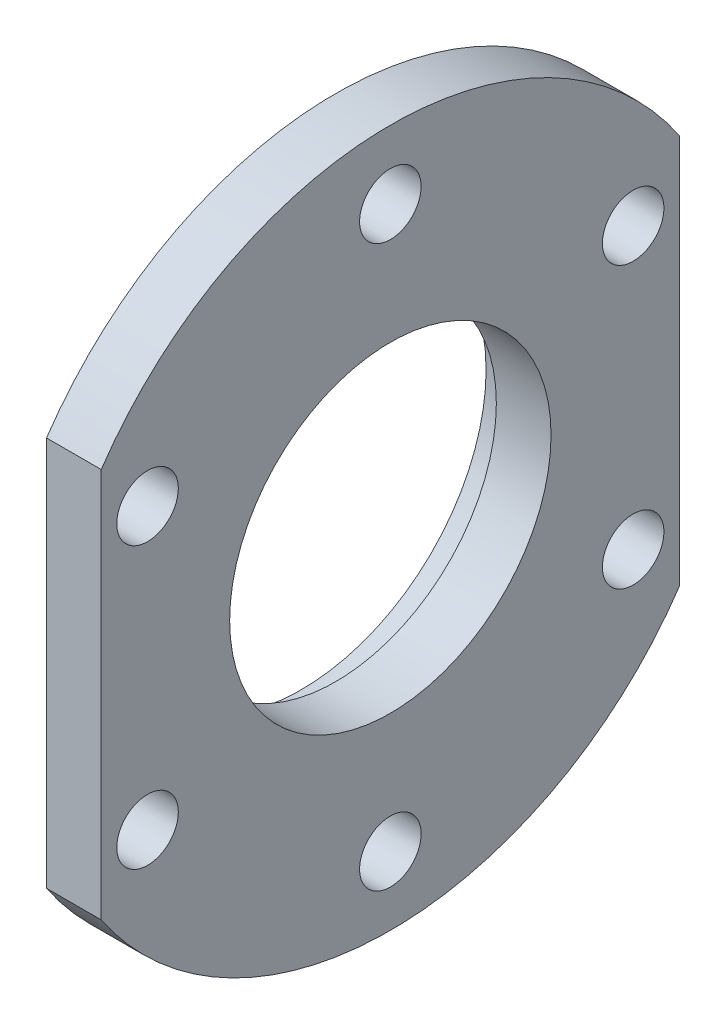
ISO-10303-21;
HEADER;
FILE_DESCRIPTION(('STEP AP214'),'2;1');
FILE_NAME('part.step','',(''),(''),'','','');
FILE_SCHEMA(('AUTOMOTIVE_DESIGN { 1 0 10303 214 1 1 1 1 }'));
ENDSEC;
DATA;
#1=APPLICATION_CONTEXT('core data for automotive mechanical design processes');
#2=APPLICATION_PROTOCOL_DEFINITION('international standard','automotive_design',2000,#1);
#3=PRODUCT_CONTEXT('',#1,'mechanical');
#4=PRODUCT('Part','Part','',(#3));
#5=PRODUCT_RELATED_PRODUCT_CATEGORY('part','',(#4));
#6=PRODUCT_DEFINITION_FORMATION('','',#4);
#7=PRODUCT_DEFINITION_CONTEXT('part definition',#1,'design');
#8=PRODUCT_DEFINITION('design','',#6,#7);
#9=PRODUCT_DEFINITION_SHAPE('','',#8);
#10=(LENGTH_UNIT() NAMED_UNIT(*) SI_UNIT(.MILLI.,.METRE.));
#11=(NAMED_UNIT(*) PLANE_ANGLE_UNIT() SI_UNIT($,.RADIAN.));
#12=(NAMED_UNIT(*) SI_UNIT($,.STERADIAN.) SOLID_ANGLE_UNIT());
#13=UNCERTAINTY_MEASURE_WITH_UNIT(LENGTH_MEASURE(1.E-05),#10,'distance_accuracy_value','');
#14=(GEOMETRIC_REPRESENTATION_CONTEXT(3) GLOBAL_UNCERTAINTY_ASSIGNED_CONTEXT((#13)) GLOBAL_UNIT_ASSIGNED_CONTEXT((#10,
#11,#12)) REPRESENTATION_CONTEXT('',''));
#15=CARTESIAN_POINT('',(0.,0.,0.));
#16=DIRECTION('',(0.,0.,1.));
#17=DIRECTION('',(1.,0.,0.));
#18=AXIS2_PLACEMENT_3D('',#15,#16,#17);
#19=CARTESIAN_POINT('',(8.,0.,0.));
#20=DIRECTION('',(1.,0.,0.));
#21=DIRECTION('',(0.,0.,-1.));
#22=AXIS2_PLACEMENT_3D('',#19,#20,#21);
#23=PLANE('',#22);
#24=CARTESIAN_POINT('',(8.,-20.4999999999997,35.5070415551622));
#25=DIRECTION('',(1.,0.,0.));
#26=DIRECTION('',(0.,0.,-1.));
#27=AXIS2_PLACEMENT_3D('',#24,#25,#26);
#28=CIRCLE('',#27,4.5);
#29=CARTESIAN_POINT('',(8.,-20.4999999999997,31.0070415551622));
#30=VERTEX_POINT('',#29);
#31=EDGE_CURVE('E222',#30,#30,#28,.T.);
#32=ORIENTED_EDGE('',*,*,#31,.F.);
#33=EDGE_LOOP('',(#32));
#34=FACE_BOUND('',#33,.T.);
#35=CARTESIAN_POINT('',(8.,-20.5000000000002,-35.5070415551619));
#36=DIRECTION('',(1.,0.,0.));
#37=DIRECTION('',(0.,0.,-1.));
#38=AXIS2_PLACEMENT_3D('',#35,#36,#37);
#39=CIRCLE('',#38,4.5);
#40=CARTESIAN_POINT('',(8.,-20.5000000000002,-40.0070415551619));
#41=VERTEX_POINT('',#40);
#42=EDGE_CURVE('E234',#41,#41,#39,.T.);
#43=ORIENTED_EDGE('',*,*,#42,.F.);
#44=EDGE_LOOP('',(#43));
#45=FACE_BOUND('',#44,.T.);
#46=CARTESIAN_POINT('',(8.,41.,0.));
#47=DIRECTION('',(1.,0.,0.));
#48=DIRECTION('',(0.,0.,-1.));
#49=AXIS2_PLACEMENT_3D('',#46,#47,#48);
#50=CIRCLE('',#49,4.5);
#51=CARTESIAN_POINT('',(8.,41.,-4.5));
#52=VERTEX_POINT('',#51);
#53=EDGE_CURVE('E246',#52,#52,#50,.T.);
#54=ORIENTED_EDGE('',*,*,#53,.F.);
#55=EDGE_LOOP('',(#54));
#56=FACE_BOUND('',#55,.T.);
#57=CARTESIAN_POINT('',(8.,0.,0.));
#58=DIRECTION('',(1.,0.,0.));
#59=DIRECTION('',(0.,0.,-1.));
#60=AXIS2_PLACEMENT_3D('',#57,#58,#59);
#61=CIRCLE('',#60,51.);
#62=CARTESIAN_POINT('',(8.,28.5188380770079,-42.2809162003073));
#63=VERTEX_POINT('',#62);
#64=CARTESIAN_POINT('',(8.,28.5188380770079,42.2809162003073));
#65=VERTEX_POINT('',#64);
#66=EDGE_CURVE('E97',#63,#65,#61,.T.);
#67=ORIENTED_EDGE('',*,*,#66,.T.);
#68=DIRECTION('',(0.,-1.,0.));
#69=VECTOR('',#68,1.);
#70=CARTESIAN_POINT('',(8.,28.5188380770079,42.2809162003073));
#71=LINE('',#70,#69);
#72=CARTESIAN_POINT('',(8.,-28.5188380770078,42.2809162003073));
#73=VERTEX_POINT('',#72);
#74=EDGE_CURVE('E92',#65,#73,#71,.T.);
#75=ORIENTED_EDGE('',*,*,#74,.T.);
#76=CARTESIAN_POINT('',(8.,0.,0.));
#77=DIRECTION('',(1.,0.,0.));
#78=DIRECTION('',(0.,0.,-1.));
#79=AXIS2_PLACEMENT_3D('',#76,#77,#78);
#80=CIRCLE('',#79,51.);
#81=CARTESIAN_POINT('',(8.,-28.5188380770078,-42.2809162003073));
#82=VERTEX_POINT('',#81);
#83=EDGE_CURVE('E95',#73,#82,#80,.T.);
#84=ORIENTED_EDGE('',*,*,#83,.T.);
#85=DIRECTION('',(0.,1.,0.));
#86=VECTOR('',#85,1.);
#87=CARTESIAN_POINT('',(8.,28.5188380770079,-42.2809162003073));
#88=LINE('',#87,#86);
#89=EDGE_CURVE('E61',#82,#63,#88,.T.);
#90=ORIENTED_EDGE('',*,*,#89,.T.);
#91=EDGE_LOOP('',(#67,#75,#84,#90));
#92=FACE_BOUND('',#91,.T.);
#93=CARTESIAN_POINT('',(8.,0.,0.));
#94=DIRECTION('',(1.,0.,0.));
#95=DIRECTION('',(0.,0.,-1.));
#96=AXIS2_PLACEMENT_3D('',#93,#94,#95);
#97=CIRCLE('',#96,23.5);
#98=CARTESIAN_POINT('',(8.,0.,-23.5));
#99=VERTEX_POINT('',#98);
#100=EDGE_CURVE('E120',#99,#99,#97,.T.);
#101=ORIENTED_EDGE('',*,*,#100,.F.);
#102=EDGE_LOOP('',(#101));
#103=FACE_BOUND('',#102,.T.);
#104=CARTESIAN_POINT('',(8.,20.4999999999999,-35.507041555162));
#105=DIRECTION('',(1.,0.,0.));
#106=DIRECTION('',(0.,0.,-1.));
#107=AXIS2_PLACEMENT_3D('',#104,#105,#106);
#108=CIRCLE('',#107,4.49999999999999);
#109=CARTESIAN_POINT('',(8.,20.4999999999999,-40.007041555162));
#110=VERTEX_POINT('',#109);
#111=EDGE_CURVE('E240',#110,#110,#108,.T.);
#112=ORIENTED_EDGE('',*,*,#111,.F.);
#113=EDGE_LOOP('',(#112));
#114=FACE_BOUND('',#113,.T.);
#115=CARTESIAN_POINT('',(8.,-41.,2.86301469785137E-13));
#116=DIRECTION('',(1.,0.,0.));
#117=DIRECTION('',(0.,0.,-1.));
#118=AXIS2_PLACEMENT_3D('',#115,#116,#117);
#119=CIRCLE('',#118,4.5);
#120=CARTESIAN_POINT('',(8.,-41.,-4.49999999999971));
#121=VERTEX_POINT('',#120);
#122=EDGE_CURVE('E228',#121,#121,#119,.T.);
#123=ORIENTED_EDGE('',*,*,#122,.F.);
#124=EDGE_LOOP('',(#123));
#125=FACE_BOUND('',#124,.T.);
#126=CARTESIAN_POINT('',(8.,20.5000000000004,35.5070415551617));
#127=DIRECTION('',(1.,0.,0.));
#128=DIRECTION('',(0.,0.,-1.));
#129=AXIS2_PLACEMENT_3D('',#126,#127,#128);
#130=CIRCLE('',#129,4.5);
#131=CARTESIAN_POINT('',(8.,20.5000000000004,31.0070415551617));
#132=VERTEX_POINT('',#131);
#133=EDGE_CURVE('E210',#132,#132,#130,.T.);
#134=ORIENTED_EDGE('',*,*,#133,.F.);
#135=EDGE_LOOP('',(#134));
#136=FACE_BOUND('',#135,.T.);
#137=ADVANCED_FACE('F43',(#34,#45,#56,#92,#103,#114,#125,#136),#23,.T.);
#138=CARTESIAN_POINT('',(0.,0.,0.));
#139=DIRECTION('',(1.,0.,0.));
#140=DIRECTION('',(0.,0.,-1.));
#141=AXIS2_PLACEMENT_3D('',#138,#139,#140);
#142=PLANE('',#141);
#143=CARTESIAN_POINT('',(0.,0.,0.));
#144=DIRECTION('',(1.,0.,0.));
#145=DIRECTION('',(0.,0.,-1.));
#146=AXIS2_PLACEMENT_3D('',#143,#144,#145);
#147=CIRCLE('',#146,31.);
#148=CARTESIAN_POINT('',(0.,0.,-31.));
#149=VERTEX_POINT('',#148);
#150=EDGE_CURVE('E133',#149,#149,#147,.F.);
#151=ORIENTED_EDGE('',*,*,#150,.F.);
#152=EDGE_LOOP('',(#151));
#153=FACE_BOUND('',#152,.T.);
#154=CARTESIAN_POINT('',(0.,0.,0.));
#155=DIRECTION('',(1.,0.,0.));
#156=DIRECTION('',(0.,0.,-1.));
#157=AXIS2_PLACEMENT_3D('',#154,#155,#156);
#158=CIRCLE('',#157,51.);
#159=CARTESIAN_POINT('',(0.,28.5188380770079,-42.2809162003073));
#160=VERTEX_POINT('',#159);
#161=CARTESIAN_POINT('',(0.,28.5188380770079,42.2809162003073));
#162=VERTEX_POINT('',#161);
#163=EDGE_CURVE('E116',#160,#162,#158,.T.);
#164=ORIENTED_EDGE('',*,*,#163,.F.);
#165=DIRECTION('',(0.,1.,0.));
#166=VECTOR('',#165,1.);
#167=CARTESIAN_POINT('',(0.,28.5188380770079,-42.2809162003073));
#168=LINE('',#167,#166);
#169=CARTESIAN_POINT('',(0.,-28.5188380770078,-42.2809162003073));
#170=VERTEX_POINT('',#169);
#171=EDGE_CURVE('E84',#170,#160,#168,.T.);
#172=ORIENTED_EDGE('',*,*,#171,.F.);
#173=CARTESIAN_POINT('',(0.,0.,0.));
#174=DIRECTION('',(1.,0.,0.));
#175=DIRECTION('',(0.,0.,-1.));
#176=AXIS2_PLACEMENT_3D('',#173,#174,#175);
#177=CIRCLE('',#176,51.);
#178=CARTESIAN_POINT('',(0.,-28.5188380770078,42.2809162003073));
#179=VERTEX_POINT('',#178);
#180=EDGE_CURVE('E78',#179,#170,#177,.T.);
#181=ORIENTED_EDGE('',*,*,#180,.F.);
#182=DIRECTION('',(0.,-1.,0.));
#183=VECTOR('',#182,1.);
#184=CARTESIAN_POINT('',(0.,28.5188380770079,42.2809162003073));
#185=LINE('',#184,#183);
#186=EDGE_CURVE('E103',#162,#179,#185,.T.);
#187=ORIENTED_EDGE('',*,*,#186,.F.);
#188=EDGE_LOOP('',(#164,#172,#181,#187));
#189=FACE_BOUND('',#188,.T.);
#190=CARTESIAN_POINT('',(0.,41.,0.));
#191=DIRECTION('',(1.,0.,0.));
#192=DIRECTION('',(0.,0.,-1.));
#193=AXIS2_PLACEMENT_3D('',#190,#191,#192);
#194=CIRCLE('',#193,4.5);
#195=CARTESIAN_POINT('',(0.,41.,-4.5));
#196=VERTEX_POINT('',#195);
#197=EDGE_CURVE('E188',#196,#196,#194,.T.);
#198=ORIENTED_EDGE('',*,*,#197,.T.);
#199=EDGE_LOOP('',(#198));
#200=FACE_BOUND('',#199,.T.);
#201=CARTESIAN_POINT('',(0.,20.4999999999999,-35.507041555162));
#202=DIRECTION('',(1.,0.,0.));
#203=DIRECTION('',(0.,0.,-1.));
#204=AXIS2_PLACEMENT_3D('',#201,#202,#203);
#205=CIRCLE('',#204,4.49999999999999);
#206=CARTESIAN_POINT('',(0.,20.4999999999999,-40.007041555162));
#207=VERTEX_POINT('',#206);
#208=EDGE_CURVE('E192',#207,#207,#205,.T.);
#209=ORIENTED_EDGE('',*,*,#208,.T.);
#210=EDGE_LOOP('',(#209));
#211=FACE_BOUND('',#210,.T.);
#212=CARTESIAN_POINT('',(0.,-20.5000000000002,-35.5070415551619));
#213=DIRECTION('',(1.,0.,0.));
#214=DIRECTION('',(0.,0.,-1.));
#215=AXIS2_PLACEMENT_3D('',#212,#213,#214);
#216=CIRCLE('',#215,4.5);
#217=CARTESIAN_POINT('',(0.,-20.5000000000002,-40.0070415551619));
#218=VERTEX_POINT('',#217);
#219=EDGE_CURVE('E196',#218,#218,#216,.T.);
#220=ORIENTED_EDGE('',*,*,#219,.T.);
#221=EDGE_LOOP('',(#220));
#222=FACE_BOUND('',#221,.T.);
#223=CARTESIAN_POINT('',(0.,-41.,2.86301469785137E-13));
#224=DIRECTION('',(1.,0.,0.));
#225=DIRECTION('',(0.,0.,-1.));
#226=AXIS2_PLACEMENT_3D('',#223,#224,#225);
#227=CIRCLE('',#226,4.5);
#228=CARTESIAN_POINT('',(0.,-41.,-4.49999999999971));
#229=VERTEX_POINT('',#228);
#230=EDGE_CURVE('E200',#229,#229,#227,.T.);
#231=ORIENTED_EDGE('',*,*,#230,.T.);
#232=EDGE_LOOP('',(#231));
#233=FACE_BOUND('',#232,.T.);
#234=CARTESIAN_POINT('',(0.,-20.4999999999997,35.5070415551622));
#235=DIRECTION('',(1.,0.,0.));
#236=DIRECTION('',(0.,0.,-1.));
#237=AXIS2_PLACEMENT_3D('',#234,#235,#236);
#238=CIRCLE('',#237,4.5);
#239=CARTESIAN_POINT('',(0.,-20.4999999999997,31.0070415551622));
#240=VERTEX_POINT('',#239);
#241=EDGE_CURVE('E204',#240,#240,#238,.T.);
#242=ORIENTED_EDGE('',*,*,#241,.T.);
#243=EDGE_LOOP('',(#242));
#244=FACE_BOUND('',#243,.T.);
#245=CARTESIAN_POINT('',(0.,20.5000000000004,35.5070415551617));
#246=DIRECTION('',(1.,0.,0.));
#247=DIRECTION('',(0.,0.,-1.));
#248=AXIS2_PLACEMENT_3D('',#245,#246,#247);
#249=CIRCLE('',#248,4.5);
#250=CARTESIAN_POINT('',(0.,20.5000000000004,31.0070415551617));
#251=VERTEX_POINT('',#250);
#252=EDGE_CURVE('E207',#251,#251,#249,.T.);
#253=ORIENTED_EDGE('',*,*,#252,.T.);
#254=EDGE_LOOP('',(#253));
#255=FACE_BOUND('',#254,.T.);
#256=ADVANCED_FACE('F157',(#153,#189,#200,#211,#222,#233,#244,#255),#142,.F.);
#257=CARTESIAN_POINT('',(8.,0.,0.));
#258=DIRECTION('',(-1.,0.,0.));
#259=DIRECTION('',(0.,0.,1.));
#260=AXIS2_PLACEMENT_3D('',#257,#258,#259);
#261=CYLINDRICAL_SURFACE('',#260,51.);
#262=ORIENTED_EDGE('',*,*,#163,.T.);
#263=DIRECTION('',(-1.,0.,0.));
#264=VECTOR('',#263,1.);
#265=CARTESIAN_POINT('',(8.,28.5188380770079,42.2809162003073));
#266=LINE('',#265,#264);
#267=EDGE_CURVE('E105',#65,#162,#266,.T.);
#268=ORIENTED_EDGE('',*,*,#267,.F.);
#269=ORIENTED_EDGE('',*,*,#66,.F.);
#270=DIRECTION('',(-1.,0.,0.));
#271=VECTOR('',#270,1.);
#272=CARTESIAN_POINT('',(8.,28.5188380770079,-42.2809162003073));
#273=LINE('',#272,#271);
#274=EDGE_CURVE('E112',#63,#160,#273,.T.);
#275=ORIENTED_EDGE('',*,*,#274,.T.);
#276=EDGE_LOOP('',(#262,#268,#269,#275));
#277=FACE_BOUND('',#276,.T.);
#278=ADVANCED_FACE('F163',(#277),#261,.T.);
#279=CARTESIAN_POINT('',(8.,28.5188380770079,42.2809162003073));
#280=DIRECTION('',(0.,0.,-1.));
#281=DIRECTION('',(-1.,0.,0.));
#282=AXIS2_PLACEMENT_3D('',#279,#280,#281);
#283=PLANE('',#282);
#284=ORIENTED_EDGE('',*,*,#186,.T.);
#285=DIRECTION('',(-1.,0.,0.));
#286=VECTOR('',#285,1.);
#287=CARTESIAN_POINT('',(8.,-28.5188380770078,42.2809162003073));
#288=LINE('',#287,#286);
#289=EDGE_CURVE('E101',#73,#179,#288,.T.);
#290=ORIENTED_EDGE('',*,*,#289,.F.);
#291=ORIENTED_EDGE('',*,*,#74,.F.);
#292=ORIENTED_EDGE('',*,*,#267,.T.);
#293=EDGE_LOOP('',(#284,#290,#291,#292));
#294=FACE_BOUND('',#293,.T.);
#295=ADVANCED_FACE('F102',(#294),#283,.F.);
#296=CARTESIAN_POINT('',(8.,0.,0.));
#297=DIRECTION('',(-1.,0.,0.));
#298=DIRECTION('',(0.,0.,1.));
#299=AXIS2_PLACEMENT_3D('',#296,#297,#298);
#300=CYLINDRICAL_SURFACE('',#299,51.);
#301=ORIENTED_EDGE('',*,*,#180,.T.);
#302=DIRECTION('',(-1.,0.,0.));
#303=VECTOR('',#302,1.);
#304=CARTESIAN_POINT('',(8.,-28.5188380770078,-42.2809162003073));
#305=LINE('',#304,#303);
#306=EDGE_CURVE('E106',#82,#170,#305,.T.);
#307=ORIENTED_EDGE('',*,*,#306,.F.);
#308=ORIENTED_EDGE('',*,*,#83,.F.);
#309=ORIENTED_EDGE('',*,*,#289,.T.);
#310=EDGE_LOOP('',(#301,#307,#308,#309));
#311=FACE_BOUND('',#310,.T.);
#312=ADVANCED_FACE('F108',(#311),#300,.T.);
#313=CARTESIAN_POINT('',(8.,28.5188380770079,-42.2809162003073));
#314=DIRECTION('',(0.,0.,1.));
#315=DIRECTION('',(1.,0.,0.));
#316=AXIS2_PLACEMENT_3D('',#313,#314,#315);
#317=PLANE('',#316);
#318=ORIENTED_EDGE('',*,*,#171,.T.);
#319=ORIENTED_EDGE('',*,*,#274,.F.);
#320=ORIENTED_EDGE('',*,*,#89,.F.);
#321=ORIENTED_EDGE('',*,*,#306,.T.);
#322=EDGE_LOOP('',(#318,#319,#320,#321));
#323=FACE_BOUND('',#322,.T.);
#324=ADVANCED_FACE('F172',(#323),#317,.F.);
#325=CARTESIAN_POINT('',(8.,0.,0.));
#326=DIRECTION('',(-1.,0.,0.));
#327=DIRECTION('',(0.,0.,1.));
#328=AXIS2_PLACEMENT_3D('',#325,#326,#327);
#329=CYLINDRICAL_SURFACE('',#328,23.5);
#330=ORIENTED_EDGE('',*,*,#100,.T.);
#331=EDGE_LOOP('',(#330));
#332=FACE_BOUND('',#331,.T.);
#333=CARTESIAN_POINT('',(0.,0.,0.));
#334=DIRECTION('',(1.,0.,0.));
#335=DIRECTION('',(0.,0.,-1.));
#336=AXIS2_PLACEMENT_3D('',#333,#334,#335);
#337=CIRCLE('',#336,23.5);
#338=CARTESIAN_POINT('',(0.,0.,-23.5));
#339=VERTEX_POINT('',#338);
#340=EDGE_CURVE('E211',#339,#339,#337,.T.);
#341=ORIENTED_EDGE('',*,*,#340,.F.);
#342=EDGE_LOOP('',(#341));
#343=FACE_BOUND('',#342,.T.);
#344=ADVANCED_FACE('F169',(#332,#343),#329,.F.);
#345=CARTESIAN_POINT('',(8.,41.,0.));
#346=DIRECTION('',(-1.,0.,0.));
#347=DIRECTION('',(0.,0.,1.));
#348=AXIS2_PLACEMENT_3D('',#345,#346,#347);
#349=CYLINDRICAL_SURFACE('',#348,4.5);
#350=ORIENTED_EDGE('',*,*,#53,.T.);
#351=EDGE_LOOP('',(#350));
#352=FACE_BOUND('',#351,.T.);
#353=ORIENTED_EDGE('',*,*,#197,.F.);
#354=EDGE_LOOP('',(#353));
#355=FACE_BOUND('',#354,.T.);
#356=ADVANCED_FACE('F288',(#352,#355),#349,.F.);
#357=CARTESIAN_POINT('',(8.,20.4999999999999,-35.507041555162));
#358=DIRECTION('',(-1.,0.,0.));
#359=DIRECTION('',(0.,0.,1.));
#360=AXIS2_PLACEMENT_3D('',#357,#358,#359);
#361=CYLINDRICAL_SURFACE('',#360,4.49999999999999);
#362=ORIENTED_EDGE('',*,*,#111,.T.);
#363=EDGE_LOOP('',(#362));
#364=FACE_BOUND('',#363,.T.);
#365=ORIENTED_EDGE('',*,*,#208,.F.);
#366=EDGE_LOOP('',(#365));
#367=FACE_BOUND('',#366,.T.);
#368=ADVANCED_FACE('F285',(#364,#367),#361,.F.);
#369=CARTESIAN_POINT('',(8.,-20.5000000000002,-35.5070415551619));
#370=DIRECTION('',(-1.,0.,0.));
#371=DIRECTION('',(0.,0.,1.));
#372=AXIS2_PLACEMENT_3D('',#369,#370,#371);
#373=CYLINDRICAL_SURFACE('',#372,4.5);
#374=ORIENTED_EDGE('',*,*,#42,.T.);
#375=EDGE_LOOP('',(#374));
#376=FACE_BOUND('',#375,.T.);
#377=ORIENTED_EDGE('',*,*,#219,.F.);
#378=EDGE_LOOP('',(#377));
#379=FACE_BOUND('',#378,.T.);
#380=ADVANCED_FACE('F281',(#376,#379),#373,.F.);
#381=CARTESIAN_POINT('',(8.,-41.,2.86301469785137E-13));
#382=DIRECTION('',(-1.,0.,0.));
#383=DIRECTION('',(0.,0.,1.));
#384=AXIS2_PLACEMENT_3D('',#381,#382,#383);
#385=CYLINDRICAL_SURFACE('',#384,4.5);
#386=ORIENTED_EDGE('',*,*,#122,.T.);
#387=EDGE_LOOP('',(#386));
#388=FACE_BOUND('',#387,.T.);
#389=ORIENTED_EDGE('',*,*,#230,.F.);
#390=EDGE_LOOP('',(#389));
#391=FACE_BOUND('',#390,.T.);
#392=ADVANCED_FACE('F275',(#388,#391),#385,.F.);
#393=CARTESIAN_POINT('',(8.,-20.4999999999997,35.5070415551622));
#394=DIRECTION('',(-1.,0.,0.));
#395=DIRECTION('',(0.,0.,1.));
#396=AXIS2_PLACEMENT_3D('',#393,#394,#395);
#397=CYLINDRICAL_SURFACE('',#396,4.5);
#398=ORIENTED_EDGE('',*,*,#31,.T.);
#399=EDGE_LOOP('',(#398));
#400=FACE_BOUND('',#399,.T.);
#401=ORIENTED_EDGE('',*,*,#241,.F.);
#402=EDGE_LOOP('',(#401));
#403=FACE_BOUND('',#402,.T.);
#404=ADVANCED_FACE('F267',(#400,#403),#397,.F.);
#405=CARTESIAN_POINT('',(8.,20.5000000000004,35.5070415551617));
#406=DIRECTION('',(-1.,0.,0.));
#407=DIRECTION('',(0.,0.,1.));
#408=AXIS2_PLACEMENT_3D('',#405,#406,#407);
#409=CYLINDRICAL_SURFACE('',#408,4.5);
#410=ORIENTED_EDGE('',*,*,#133,.T.);
#411=EDGE_LOOP('',(#410));
#412=FACE_BOUND('',#411,.T.);
#413=ORIENTED_EDGE('',*,*,#252,.F.);
#414=EDGE_LOOP('',(#413));
#415=FACE_BOUND('',#414,.T.);
#416=ADVANCED_FACE('F265',(#412,#415),#409,.F.);
#417=CARTESIAN_POINT('',(-5.,0.,0.));
#418=DIRECTION('',(1.,0.,0.));
#419=DIRECTION('',(0.,0.,-1.));
#420=AXIS2_PLACEMENT_3D('',#417,#418,#419);
#421=CYLINDRICAL_SURFACE('',#420,31.);
#422=CARTESIAN_POINT('',(-4.5,0.,0.));
#423=DIRECTION('',(-1.,0.,0.));
#424=DIRECTION('',(0.,0.,1.));
#425=AXIS2_PLACEMENT_3D('',#422,#423,#424);
#426=CIRCLE('',#425,31.);
#427=CARTESIAN_POINT('',(-4.5,0.,31.));
#428=VERTEX_POINT('',#427);
#429=EDGE_CURVE('E11',#428,#428,#426,.F.);
#430=ORIENTED_EDGE('',*,*,#429,.T.);
#431=EDGE_LOOP('',(#430));
#432=FACE_BOUND('',#431,.T.);
#433=ORIENTED_EDGE('',*,*,#150,.T.);
#434=EDGE_LOOP('',(#433));
#435=FACE_BOUND('',#434,.T.);
#436=ADVANCED_FACE('F152',(#432,#435),#421,.T.);
#437=CARTESIAN_POINT('',(-5.,0.,0.));
#438=DIRECTION('',(-1.,0.,0.));
#439=DIRECTION('',(0.,0.,1.));
#440=AXIS2_PLACEMENT_3D('',#437,#438,#439);
#441=PLANE('',#440);
#442=CARTESIAN_POINT('',(-5.,0.,0.));
#443=DIRECTION('',(1.,0.,0.));
#444=DIRECTION('',(0.,0.,-1.));
#445=AXIS2_PLACEMENT_3D('',#442,#443,#444);
#446=CIRCLE('',#445,27.);
#447=CARTESIAN_POINT('',(-5.,0.,-27.));
#448=VERTEX_POINT('',#447);
#449=EDGE_CURVE('E218',#448,#448,#446,.T.);
#450=ORIENTED_EDGE('',*,*,#449,.T.);
#451=EDGE_LOOP('',(#450));
#452=FACE_BOUND('',#451,.T.);
#453=CARTESIAN_POINT('',(-5.,0.,0.));
#454=DIRECTION('',(-1.,0.,0.));
#455=DIRECTION('',(0.,0.,1.));
#456=AXIS2_PLACEMENT_3D('',#453,#454,#455);
#457=CIRCLE('',#456,30.5);
#458=CARTESIAN_POINT('',(-5.,0.,30.5));
#459=VERTEX_POINT('',#458);
#460=EDGE_CURVE('E53',#459,#459,#457,.T.);
#461=ORIENTED_EDGE('',*,*,#460,.T.);
#462=EDGE_LOOP('',(#461));
#463=FACE_BOUND('',#462,.T.);
#464=ADVANCED_FACE('F140',(#452,#463),#441,.T.);
#465=CARTESIAN_POINT('',(-4.5,0.,0.));
#466=DIRECTION('',(-1.,0.,0.));
#467=DIRECTION('',(0.,0.,1.));
#468=AXIS2_PLACEMENT_3D('',#465,#466,#467);
#469=TOROIDAL_SURFACE('',#468,30.5,0.5);
#470=ORIENTED_EDGE('',*,*,#429,.F.);
#471=EDGE_LOOP('',(#470));
#472=FACE_BOUND('',#471,.T.);
#473=ORIENTED_EDGE('',*,*,#460,.F.);
#474=EDGE_LOOP('',(#473));
#475=FACE_BOUND('',#474,.T.);
#476=ADVANCED_FACE('F45',(#472,#475),#469,.T.);
#477=CARTESIAN_POINT('',(-5.,0.,0.));
#478=DIRECTION('',(1.,0.,0.));
#479=DIRECTION('',(0.,0.,-1.));
#480=AXIS2_PLACEMENT_3D('',#477,#478,#479);
#481=CYLINDRICAL_SURFACE('',#480,27.);
#482=ORIENTED_EDGE('',*,*,#449,.F.);
#483=EDGE_LOOP('',(#482));
#484=FACE_BOUND('',#483,.T.);
#485=CARTESIAN_POINT('',(0.,0.,0.));
#486=DIRECTION('',(1.,0.,0.));
#487=DIRECTION('',(0.,0.,-1.));
#488=AXIS2_PLACEMENT_3D('',#485,#486,#487);
#489=CIRCLE('',#488,27.);
#490=CARTESIAN_POINT('',(0.,0.,-27.));
#491=VERTEX_POINT('',#490);
#492=EDGE_CURVE('E439',#491,#491,#489,.T.);
#493=ORIENTED_EDGE('',*,*,#492,.T.);
#494=EDGE_LOOP('',(#493));
#495=FACE_BOUND('',#494,.T.);
#496=ADVANCED_FACE('F143',(#484,#495),#481,.F.);
#497=CARTESIAN_POINT('',(0.,0.,0.));
#498=DIRECTION('',(1.,0.,0.));
#499=DIRECTION('',(0.,0.,-1.));
#500=AXIS2_PLACEMENT_3D('',#497,#498,#499);
#501=PLANE('',#500);
#502=ORIENTED_EDGE('',*,*,#340,.T.);
#503=EDGE_LOOP('',(#502));
#504=FACE_BOUND('',#503,.T.);
#505=ORIENTED_EDGE('',*,*,#492,.F.);
#506=EDGE_LOOP('',(#505));
#507=FACE_BOUND('',#506,.T.);
#508=ADVANCED_FACE('F149',(#504,#507),#501,.F.);
#509=CLOSED_SHELL('',(#137,#256,#278,#295,#312,#324,#344,#356,#368,#380,#392,#404,#416,#436,
#464,#476,#496,#508));
#510=MANIFOLD_SOLID_BREP('B2',#509);
#511=ADVANCED_BREP_SHAPE_REPRESENTATION('',(#18,#510),#14);
#512=SHAPE_DEFINITION_REPRESENTATION(#9,#511);
ENDSEC;
END-ISO-10303-21;
